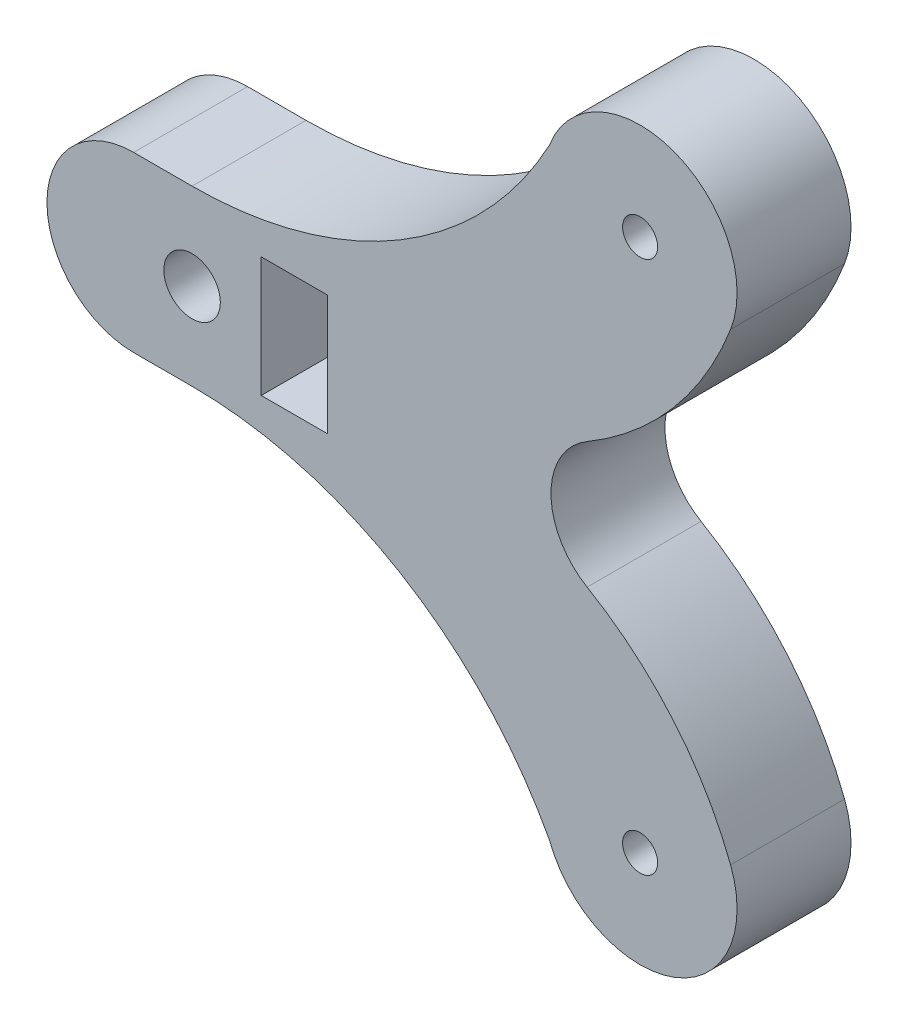
ISO-10303-21;
HEADER;
FILE_DESCRIPTION(('STEP AP214'),'2;1');
FILE_NAME('part.step','',(''),(''),'','','');
FILE_SCHEMA(('AUTOMOTIVE_DESIGN { 1 0 10303 214 1 1 1 1 }'));
ENDSEC;
DATA;
#1=APPLICATION_CONTEXT('core data for automotive mechanical design processes');
#2=APPLICATION_PROTOCOL_DEFINITION('international standard','automotive_design',2000,#1);
#3=PRODUCT_CONTEXT('',#1,'mechanical');
#4=PRODUCT('Part','Part','',(#3));
#5=PRODUCT_RELATED_PRODUCT_CATEGORY('part','',(#4));
#6=PRODUCT_DEFINITION_FORMATION('','',#4);
#7=PRODUCT_DEFINITION_CONTEXT('part definition',#1,'design');
#8=PRODUCT_DEFINITION('design','',#6,#7);
#9=PRODUCT_DEFINITION_SHAPE('','',#8);
#10=(LENGTH_UNIT() NAMED_UNIT(*) SI_UNIT(.MILLI.,.METRE.));
#11=(NAMED_UNIT(*) PLANE_ANGLE_UNIT() SI_UNIT($,.RADIAN.));
#12=(NAMED_UNIT(*) SI_UNIT($,.STERADIAN.) SOLID_ANGLE_UNIT());
#13=UNCERTAINTY_MEASURE_WITH_UNIT(LENGTH_MEASURE(1.E-05),#10,'distance_accuracy_value','');
#14=(GEOMETRIC_REPRESENTATION_CONTEXT(3) GLOBAL_UNCERTAINTY_ASSIGNED_CONTEXT((#13)) GLOBAL_UNIT_ASSIGNED_CONTEXT((#10,
#11,#12)) REPRESENTATION_CONTEXT('',''));
#15=CARTESIAN_POINT('',(0.,0.,0.));
#16=DIRECTION('',(0.,0.,1.));
#17=DIRECTION('',(1.,0.,0.));
#18=AXIS2_PLACEMENT_3D('',#15,#16,#17);
#19=CARTESIAN_POINT('',(588.919699582057,410.117464707351,5.85));
#20=DIRECTION('',(0.,0.,-1.));
#21=DIRECTION('',(-1.,0.,0.));
#22=AXIS2_PLACEMENT_3D('',#19,#20,#21);
#23=PLANE('',#22);
#24=CARTESIAN_POINT('',(588.919699582057,435.365819013464,5.85));
#25=DIRECTION('',(0.,0.,1.));
#26=DIRECTION('',(1.,0.,0.));
#27=AXIS2_PLACEMENT_3D('',#24,#25,#26);
#28=CIRCLE('',#27,1.44981300000002);
#29=CARTESIAN_POINT('',(590.369512582057,435.365819013464,5.85));
#30=VERTEX_POINT('',#29);
#31=EDGE_CURVE('E187',#30,#30,#28,.T.);
#32=ORIENTED_EDGE('',*,*,#31,.F.);
#33=EDGE_LOOP('',(#32));
#34=FACE_BOUND('',#33,.T.);
#35=CARTESIAN_POINT('',(611.919699582057,449.057086684598,5.85));
#36=DIRECTION('',(0.,0.,1.));
#37=DIRECTION('',(1.,0.,0.));
#38=AXIS2_PLACEMENT_3D('',#35,#36,#37);
#39=CIRCLE('',#38,0.899963000000106);
#40=CARTESIAN_POINT('',(612.819662582057,449.057086684598,5.85));
#41=VERTEX_POINT('',#40);
#42=EDGE_CURVE('E188',#41,#41,#39,.T.);
#43=ORIENTED_EDGE('',*,*,#42,.F.);
#44=EDGE_LOOP('',(#43));
#45=FACE_BOUND('',#44,.T.);
#46=CARTESIAN_POINT('',(588.919699582057,410.117464707351,5.85));
#47=DIRECTION('',(0.,0.,-1.));
#48=DIRECTION('',(-1.,0.,0.));
#49=AXIS2_PLACEMENT_3D('',#46,#47,#48);
#50=CIRCLE('',#49,20.7985413061131);
#51=CARTESIAN_POINT('',(588.919699582057,430.916006013464,5.85));
#52=VERTEX_POINT('',#51);
#53=CARTESIAN_POINT('',(607.258051131711,419.929915109946,5.85));
#54=VERTEX_POINT('',#53);
#55=EDGE_CURVE('E201',#52,#54,#50,.T.);
#56=ORIENTED_EDGE('',*,*,#55,.T.);
#57=CARTESIAN_POINT('',(611.919699582057,421.674551342329,5.85));
#58=DIRECTION('',(0.,0.,1.));
#59=DIRECTION('',(1.,0.,0.));
#60=AXIS2_PLACEMENT_3D('',#57,#58,#59);
#61=CIRCLE('',#60,4.9774212056002);
#62=CARTESIAN_POINT('',(616.564448765373,423.463692723563,5.85));
#63=VERTEX_POINT('',#62);
#64=EDGE_CURVE('E205',#54,#63,#61,.T.);
#65=ORIENTED_EDGE('',*,*,#64,.T.);
#66=CARTESIAN_POINT('',(600.508172124817,417.278870285931,5.85));
#67=DIRECTION('',(0.,0.,1.));
#68=DIRECTION('',(-1.,0.,0.));
#69=AXIS2_PLACEMENT_3D('',#66,#67,#68);
#70=CIRCLE('',#69,17.2062793230583);
#71=CARTESIAN_POINT('',(609.19986076651,432.128469495976,5.85));
#72=VERTEX_POINT('',#71);
#73=EDGE_CURVE('E210',#63,#72,#70,.T.);
#74=ORIENTED_EDGE('',*,*,#73,.T.);
#75=CARTESIAN_POINT('',(611.09472901395,435.365819013464,5.85));
#76=DIRECTION('',(0.,0.,-1.));
#77=DIRECTION('',(1.,0.,0.));
#78=AXIS2_PLACEMENT_3D('',#75,#76,#77);
#79=CIRCLE('',#78,3.75112750696853);
#80=CARTESIAN_POINT('',(609.199860766509,438.603168530952,5.85));
#81=VERTEX_POINT('',#80);
#82=EDGE_CURVE('E214',#72,#81,#79,.T.);
#83=ORIENTED_EDGE('',*,*,#82,.T.);
#84=CARTESIAN_POINT('',(600.508172124817,453.452767740997,5.85));
#85=DIRECTION('',(0.,0.,1.));
#86=DIRECTION('',(1.,0.,0.));
#87=AXIS2_PLACEMENT_3D('',#84,#85,#86);
#88=CIRCLE('',#87,17.2062793230582);
#89=CARTESIAN_POINT('',(616.564448765373,447.267945303365,5.85));
#90=VERTEX_POINT('',#89);
#91=EDGE_CURVE('E222',#81,#90,#88,.T.);
#92=ORIENTED_EDGE('',*,*,#91,.T.);
#93=CARTESIAN_POINT('',(611.919699582057,449.057086684598,5.85));
#94=DIRECTION('',(0.,0.,1.));
#95=DIRECTION('',(-1.,0.,0.));
#96=AXIS2_PLACEMENT_3D('',#93,#94,#95);
#97=CIRCLE('',#96,4.97742120560018);
#98=CARTESIAN_POINT('',(607.258051131711,450.801722916982,5.85));
#99=VERTEX_POINT('',#98);
#100=EDGE_CURVE('E225',#90,#99,#97,.T.);
#101=ORIENTED_EDGE('',*,*,#100,.T.);
#102=CARTESIAN_POINT('',(588.919699582057,460.614173319577,5.85));
#103=DIRECTION('',(0.,0.,-1.));
#104=DIRECTION('',(1.,0.,0.));
#105=AXIS2_PLACEMENT_3D('',#102,#103,#104);
#106=CIRCLE('',#105,20.7985413061131);
#107=CARTESIAN_POINT('',(588.919699582057,439.815632013464,5.85));
#108=VERTEX_POINT('',#107);
#109=EDGE_CURVE('E229',#99,#108,#106,.T.);
#110=ORIENTED_EDGE('',*,*,#109,.T.);
#111=DIRECTION('',(-1.,0.,0.));
#112=VECTOR('',#111,1.);
#113=CARTESIAN_POINT('',(588.919699582057,439.815632013464,5.85));
#114=LINE('',#113,#112);
#115=CARTESIAN_POINT('',(585.919699582057,439.815632013464,5.85));
#116=VERTEX_POINT('',#115);
#117=EDGE_CURVE('E233',#108,#116,#114,.T.);
#118=ORIENTED_EDGE('',*,*,#117,.T.);
#119=CARTESIAN_POINT('',(585.919699582057,435.365819013464,5.85));
#120=DIRECTION('',(0.,0.,1.));
#121=DIRECTION('',(1.,0.,0.));
#122=AXIS2_PLACEMENT_3D('',#119,#120,#121);
#123=CIRCLE('',#122,4.44981300000002);
#124=CARTESIAN_POINT('',(585.919699582057,430.916006013464,5.85));
#125=VERTEX_POINT('',#124);
#126=EDGE_CURVE('E237',#116,#125,#123,.T.);
#127=ORIENTED_EDGE('',*,*,#126,.T.);
#128=DIRECTION('',(1.,0.,0.));
#129=VECTOR('',#128,1.);
#130=CARTESIAN_POINT('',(588.919699582057,430.916006013464,5.85));
#131=LINE('',#130,#129);
#132=EDGE_CURVE('E240',#125,#52,#131,.T.);
#133=ORIENTED_EDGE('',*,*,#132,.T.);
#134=EDGE_LOOP('',(#56,#65,#74,#83,#92,#101,#110,#118,#127,#133));
#135=FACE_BOUND('',#134,.T.);
#136=CARTESIAN_POINT('',(611.919699582057,421.674551342329,5.85));
#137=DIRECTION('',(0.,0.,1.));
#138=DIRECTION('',(1.,0.,0.));
#139=AXIS2_PLACEMENT_3D('',#136,#137,#138);
#140=CIRCLE('',#139,0.899963000000106);
#141=CARTESIAN_POINT('',(612.819662582057,421.674551342329,5.85));
#142=VERTEX_POINT('',#141);
#143=EDGE_CURVE('E176',#142,#142,#140,.T.);
#144=ORIENTED_EDGE('',*,*,#143,.F.);
#145=EDGE_LOOP('',(#144));
#146=FACE_BOUND('',#145,.T.);
#147=DIRECTION('',(0.,-1.,0.));
#148=VECTOR('',#147,1.);
#149=CARTESIAN_POINT('',(592.469512582057,432.283227624903,5.85));
#150=LINE('',#149,#148);
#151=CARTESIAN_POINT('',(592.469512582057,438.448410402024,5.85));
#152=VERTEX_POINT('',#151);
#153=CARTESIAN_POINT('',(592.469512582057,432.283227624903,5.85));
#154=VERTEX_POINT('',#153);
#155=EDGE_CURVE('E137',#152,#154,#150,.T.);
#156=ORIENTED_EDGE('',*,*,#155,.F.);
#157=DIRECTION('',(-1.,0.,0.));
#158=VECTOR('',#157,1.);
#159=CARTESIAN_POINT('',(592.469512582057,438.448410402024,5.85));
#160=LINE('',#159,#158);
#161=CARTESIAN_POINT('',(595.869523582057,438.448410402024,5.85));
#162=VERTEX_POINT('',#161);
#163=EDGE_CURVE('E161',#162,#152,#160,.T.);
#164=ORIENTED_EDGE('',*,*,#163,.F.);
#165=DIRECTION('',(0.,1.,0.));
#166=VECTOR('',#165,1.);
#167=CARTESIAN_POINT('',(595.869523582057,438.448410402024,5.85));
#168=LINE('',#167,#166);
#169=CARTESIAN_POINT('',(595.869523582057,432.283227624903,5.85));
#170=VERTEX_POINT('',#169);
#171=EDGE_CURVE('E158',#170,#162,#168,.T.);
#172=ORIENTED_EDGE('',*,*,#171,.F.);
#173=DIRECTION('',(1.,0.,0.));
#174=VECTOR('',#173,1.);
#175=CARTESIAN_POINT('',(595.869523582057,432.283227624903,5.85));
#176=LINE('',#175,#174);
#177=EDGE_CURVE('E146',#154,#170,#176,.T.);
#178=ORIENTED_EDGE('',*,*,#177,.F.);
#179=EDGE_LOOP('',(#156,#164,#172,#178));
#180=FACE_BOUND('',#179,.T.);
#181=ADVANCED_FACE('F36',(#34,#45,#135,#146,#180),#23,.F.);
#182=CARTESIAN_POINT('',(588.919699582057,410.117464707351,0.));
#183=DIRECTION('',(0.,0.,-1.));
#184=DIRECTION('',(-1.,0.,0.));
#185=AXIS2_PLACEMENT_3D('',#182,#183,#184);
#186=PLANE('',#185);
#187=CARTESIAN_POINT('',(588.919699582057,435.365819013464,0.));
#188=DIRECTION('',(0.,0.,1.));
#189=DIRECTION('',(1.,0.,0.));
#190=AXIS2_PLACEMENT_3D('',#187,#188,#189);
#191=CIRCLE('',#190,1.44981300000002);
#192=CARTESIAN_POINT('',(590.369512582057,435.365819013464,0.));
#193=VERTEX_POINT('',#192);
#194=EDGE_CURVE('E154',#193,#193,#191,.T.);
#195=ORIENTED_EDGE('',*,*,#194,.T.);
#196=EDGE_LOOP('',(#195));
#197=FACE_BOUND('',#196,.T.);
#198=CARTESIAN_POINT('',(611.919699582057,449.057086684598,0.));
#199=DIRECTION('',(0.,0.,1.));
#200=DIRECTION('',(1.,0.,0.));
#201=AXIS2_PLACEMENT_3D('',#198,#199,#200);
#202=CIRCLE('',#201,0.899963000000106);
#203=CARTESIAN_POINT('',(612.819662582057,449.057086684598,0.));
#204=VERTEX_POINT('',#203);
#205=EDGE_CURVE('E182',#204,#204,#202,.T.);
#206=ORIENTED_EDGE('',*,*,#205,.T.);
#207=EDGE_LOOP('',(#206));
#208=FACE_BOUND('',#207,.T.);
#209=CARTESIAN_POINT('',(588.919699582057,410.117464707351,0.));
#210=DIRECTION('',(0.,0.,-1.));
#211=DIRECTION('',(-1.,0.,0.));
#212=AXIS2_PLACEMENT_3D('',#209,#210,#211);
#213=CIRCLE('',#212,20.7985413061131);
#214=CARTESIAN_POINT('',(588.919699582057,430.916006013464,0.));
#215=VERTEX_POINT('',#214);
#216=CARTESIAN_POINT('',(607.258051131711,419.929915109946,0.));
#217=VERTEX_POINT('',#216);
#218=EDGE_CURVE('E193',#215,#217,#213,.T.);
#219=ORIENTED_EDGE('',*,*,#218,.F.);
#220=DIRECTION('',(1.,0.,0.));
#221=VECTOR('',#220,1.);
#222=CARTESIAN_POINT('',(588.919699582057,430.916006013464,0.));
#223=LINE('',#222,#221);
#224=CARTESIAN_POINT('',(585.919699582057,430.916006013464,0.));
#225=VERTEX_POINT('',#224);
#226=EDGE_CURVE('E206',#225,#215,#223,.T.);
#227=ORIENTED_EDGE('',*,*,#226,.F.);
#228=CARTESIAN_POINT('',(585.919699582057,435.365819013464,0.));
#229=DIRECTION('',(0.,0.,1.));
#230=DIRECTION('',(1.,0.,0.));
#231=AXIS2_PLACEMENT_3D('',#228,#229,#230);
#232=CIRCLE('',#231,4.44981300000002);
#233=CARTESIAN_POINT('',(585.919699582057,439.815632013464,0.));
#234=VERTEX_POINT('',#233);
#235=EDGE_CURVE('E261',#234,#225,#232,.T.);
#236=ORIENTED_EDGE('',*,*,#235,.F.);
#237=DIRECTION('',(-1.,0.,0.));
#238=VECTOR('',#237,1.);
#239=CARTESIAN_POINT('',(588.919699582057,439.815632013464,0.));
#240=LINE('',#239,#238);
#241=CARTESIAN_POINT('',(588.919699582057,439.815632013464,0.));
#242=VERTEX_POINT('',#241);
#243=EDGE_CURVE('E259',#242,#234,#240,.T.);
#244=ORIENTED_EDGE('',*,*,#243,.F.);
#245=CARTESIAN_POINT('',(588.919699582057,460.614173319577,0.));
#246=DIRECTION('',(0.,0.,-1.));
#247=DIRECTION('',(1.,0.,0.));
#248=AXIS2_PLACEMENT_3D('',#245,#246,#247);
#249=CIRCLE('',#248,20.7985413061131);
#250=CARTESIAN_POINT('',(607.258051131711,450.801722916982,0.));
#251=VERTEX_POINT('',#250);
#252=EDGE_CURVE('E257',#251,#242,#249,.T.);
#253=ORIENTED_EDGE('',*,*,#252,.F.);
#254=CARTESIAN_POINT('',(611.919699582057,449.057086684598,0.));
#255=DIRECTION('',(0.,0.,1.));
#256=DIRECTION('',(-1.,0.,0.));
#257=AXIS2_PLACEMENT_3D('',#254,#255,#256);
#258=CIRCLE('',#257,4.97742120560018);
#259=CARTESIAN_POINT('',(616.564448765373,447.267945303365,0.));
#260=VERTEX_POINT('',#259);
#261=EDGE_CURVE('E255',#260,#251,#258,.T.);
#262=ORIENTED_EDGE('',*,*,#261,.F.);
#263=CARTESIAN_POINT('',(600.508172124817,453.452767740997,0.));
#264=DIRECTION('',(0.,0.,1.));
#265=DIRECTION('',(1.,0.,0.));
#266=AXIS2_PLACEMENT_3D('',#263,#264,#265);
#267=CIRCLE('',#266,17.2062793230582);
#268=CARTESIAN_POINT('',(609.199860766509,438.603168530952,0.));
#269=VERTEX_POINT('',#268);
#270=EDGE_CURVE('E253',#269,#260,#267,.T.);
#271=ORIENTED_EDGE('',*,*,#270,.F.);
#272=CARTESIAN_POINT('',(611.09472901395,435.365819013464,0.));
#273=DIRECTION('',(0.,0.,-1.));
#274=DIRECTION('',(1.,0.,0.));
#275=AXIS2_PLACEMENT_3D('',#272,#273,#274);
#276=CIRCLE('',#275,3.75112750696853);
#277=CARTESIAN_POINT('',(609.19986076651,432.128469495976,0.));
#278=VERTEX_POINT('',#277);
#279=EDGE_CURVE('E251',#278,#269,#276,.T.);
#280=ORIENTED_EDGE('',*,*,#279,.F.);
#281=CARTESIAN_POINT('',(600.508172124817,417.278870285931,0.));
#282=DIRECTION('',(0.,0.,1.));
#283=DIRECTION('',(-1.,0.,0.));
#284=AXIS2_PLACEMENT_3D('',#281,#282,#283);
#285=CIRCLE('',#284,17.2062793230583);
#286=CARTESIAN_POINT('',(616.564448765373,423.463692723563,0.));
#287=VERTEX_POINT('',#286);
#288=EDGE_CURVE('E249',#287,#278,#285,.T.);
#289=ORIENTED_EDGE('',*,*,#288,.F.);
#290=CARTESIAN_POINT('',(611.919699582057,421.674551342329,0.));
#291=DIRECTION('',(0.,0.,1.));
#292=DIRECTION('',(1.,0.,0.));
#293=AXIS2_PLACEMENT_3D('',#290,#291,#292);
#294=CIRCLE('',#293,4.9774212056002);
#295=EDGE_CURVE('E247',#217,#287,#294,.T.);
#296=ORIENTED_EDGE('',*,*,#295,.F.);
#297=EDGE_LOOP('',(#219,#227,#236,#244,#253,#262,#271,#280,#289,#296));
#298=FACE_BOUND('',#297,.T.);
#299=CARTESIAN_POINT('',(611.919699582057,421.674551342329,0.));
#300=DIRECTION('',(0.,0.,1.));
#301=DIRECTION('',(1.,0.,0.));
#302=AXIS2_PLACEMENT_3D('',#299,#300,#301);
#303=CIRCLE('',#302,0.899963000000106);
#304=CARTESIAN_POINT('',(612.819662582057,421.674551342329,0.));
#305=VERTEX_POINT('',#304);
#306=EDGE_CURVE('E183',#305,#305,#303,.T.);
#307=ORIENTED_EDGE('',*,*,#306,.T.);
#308=EDGE_LOOP('',(#307));
#309=FACE_BOUND('',#308,.T.);
#310=DIRECTION('',(-1.,0.,0.));
#311=VECTOR('',#310,1.);
#312=CARTESIAN_POINT('',(592.469512582057,438.448410402024,0.));
#313=LINE('',#312,#311);
#314=CARTESIAN_POINT('',(595.869523582057,438.448410402024,0.));
#315=VERTEX_POINT('',#314);
#316=CARTESIAN_POINT('',(592.469512582057,438.448410402024,0.));
#317=VERTEX_POINT('',#316);
#318=EDGE_CURVE('E147',#315,#317,#313,.T.);
#319=ORIENTED_EDGE('',*,*,#318,.T.);
#320=DIRECTION('',(0.,-1.,0.));
#321=VECTOR('',#320,1.);
#322=CARTESIAN_POINT('',(592.469512582057,432.283227624903,0.));
#323=LINE('',#322,#321);
#324=CARTESIAN_POINT('',(592.469512582057,432.283227624903,0.));
#325=VERTEX_POINT('',#324);
#326=EDGE_CURVE('E59',#317,#325,#323,.T.);
#327=ORIENTED_EDGE('',*,*,#326,.T.);
#328=DIRECTION('',(1.,0.,0.));
#329=VECTOR('',#328,1.);
#330=CARTESIAN_POINT('',(595.869523582057,432.283227624903,0.));
#331=LINE('',#330,#329);
#332=CARTESIAN_POINT('',(595.869523582057,432.283227624903,0.));
#333=VERTEX_POINT('',#332);
#334=EDGE_CURVE('E153',#325,#333,#331,.T.);
#335=ORIENTED_EDGE('',*,*,#334,.T.);
#336=DIRECTION('',(0.,1.,0.));
#337=VECTOR('',#336,1.);
#338=CARTESIAN_POINT('',(595.869523582057,438.448410402024,0.));
#339=LINE('',#338,#337);
#340=EDGE_CURVE('E512',#333,#315,#339,.T.);
#341=ORIENTED_EDGE('',*,*,#340,.T.);
#342=EDGE_LOOP('',(#319,#327,#335,#341));
#343=FACE_BOUND('',#342,.T.);
#344=ADVANCED_FACE('F297',(#197,#208,#298,#309,#343),#186,.T.);
#345=CARTESIAN_POINT('',(588.919699582057,410.117464707351,5.85));
#346=DIRECTION('',(0.,0.,-1.));
#347=DIRECTION('',(-1.,0.,0.));
#348=AXIS2_PLACEMENT_3D('',#345,#346,#347);
#349=CYLINDRICAL_SURFACE('',#348,20.7985413061131);
#350=ORIENTED_EDGE('',*,*,#218,.T.);
#351=DIRECTION('',(0.,0.,-1.));
#352=VECTOR('',#351,1.);
#353=CARTESIAN_POINT('',(607.258051131711,419.929915109946,5.85));
#354=LINE('',#353,#352);
#355=EDGE_CURVE('E12',#54,#217,#354,.T.);
#356=ORIENTED_EDGE('',*,*,#355,.F.);
#357=ORIENTED_EDGE('',*,*,#55,.F.);
#358=DIRECTION('',(0.,0.,-1.));
#359=VECTOR('',#358,1.);
#360=CARTESIAN_POINT('',(588.919699582057,430.916006013464,5.85));
#361=LINE('',#360,#359);
#362=EDGE_CURVE('E244',#52,#215,#361,.T.);
#363=ORIENTED_EDGE('',*,*,#362,.T.);
#364=EDGE_LOOP('',(#350,#356,#357,#363));
#365=FACE_BOUND('',#364,.T.);
#366=ADVANCED_FACE('F38',(#365),#349,.F.);
#367=CARTESIAN_POINT('',(611.919699582057,421.674551342329,5.85));
#368=DIRECTION('',(0.,0.,-1.));
#369=DIRECTION('',(-1.,0.,0.));
#370=AXIS2_PLACEMENT_3D('',#367,#368,#369);
#371=CYLINDRICAL_SURFACE('',#370,4.9774212056002);
#372=ORIENTED_EDGE('',*,*,#295,.T.);
#373=DIRECTION('',(0.,0.,-1.));
#374=VECTOR('',#373,1.);
#375=CARTESIAN_POINT('',(616.564448765373,423.463692723563,5.85));
#376=LINE('',#375,#374);
#377=EDGE_CURVE('E44',#63,#287,#376,.T.);
#378=ORIENTED_EDGE('',*,*,#377,.F.);
#379=ORIENTED_EDGE('',*,*,#64,.F.);
#380=ORIENTED_EDGE('',*,*,#355,.T.);
#381=EDGE_LOOP('',(#372,#378,#379,#380));
#382=FACE_BOUND('',#381,.T.);
#383=ADVANCED_FACE('F379',(#382),#371,.T.);
#384=CARTESIAN_POINT('',(600.508172124817,417.278870285931,5.85));
#385=DIRECTION('',(0.,0.,-1.));
#386=DIRECTION('',(-1.,0.,0.));
#387=AXIS2_PLACEMENT_3D('',#384,#385,#386);
#388=CYLINDRICAL_SURFACE('',#387,17.2062793230583);
#389=ORIENTED_EDGE('',*,*,#288,.T.);
#390=DIRECTION('',(0.,0.,-1.));
#391=VECTOR('',#390,1.);
#392=CARTESIAN_POINT('',(609.19986076651,432.128469495976,5.85));
#393=LINE('',#392,#391);
#394=EDGE_CURVE('E284',#72,#278,#393,.T.);
#395=ORIENTED_EDGE('',*,*,#394,.F.);
#396=ORIENTED_EDGE('',*,*,#73,.F.);
#397=ORIENTED_EDGE('',*,*,#377,.T.);
#398=EDGE_LOOP('',(#389,#395,#396,#397));
#399=FACE_BOUND('',#398,.T.);
#400=ADVANCED_FACE('F291',(#399),#388,.T.);
#401=CARTESIAN_POINT('',(611.09472901395,435.365819013464,5.85));
#402=DIRECTION('',(0.,0.,-1.));
#403=DIRECTION('',(-1.,0.,0.));
#404=AXIS2_PLACEMENT_3D('',#401,#402,#403);
#405=CYLINDRICAL_SURFACE('',#404,3.75112750696853);
#406=ORIENTED_EDGE('',*,*,#279,.T.);
#407=DIRECTION('',(0.,0.,-1.));
#408=VECTOR('',#407,1.);
#409=CARTESIAN_POINT('',(609.199860766509,438.603168530952,5.85));
#410=LINE('',#409,#408);
#411=EDGE_CURVE('E281',#81,#269,#410,.T.);
#412=ORIENTED_EDGE('',*,*,#411,.F.);
#413=ORIENTED_EDGE('',*,*,#82,.F.);
#414=ORIENTED_EDGE('',*,*,#394,.T.);
#415=EDGE_LOOP('',(#406,#412,#413,#414));
#416=FACE_BOUND('',#415,.T.);
#417=ADVANCED_FACE('F303',(#416),#405,.F.);
#418=CARTESIAN_POINT('',(600.508172124817,453.452767740997,5.85));
#419=DIRECTION('',(0.,0.,-1.));
#420=DIRECTION('',(-1.,0.,0.));
#421=AXIS2_PLACEMENT_3D('',#418,#419,#420);
#422=CYLINDRICAL_SURFACE('',#421,17.2062793230582);
#423=ORIENTED_EDGE('',*,*,#270,.T.);
#424=DIRECTION('',(0.,0.,-1.));
#425=VECTOR('',#424,1.);
#426=CARTESIAN_POINT('',(616.564448765373,447.267945303365,5.85));
#427=LINE('',#426,#425);
#428=EDGE_CURVE('E278',#90,#260,#427,.T.);
#429=ORIENTED_EDGE('',*,*,#428,.F.);
#430=ORIENTED_EDGE('',*,*,#91,.F.);
#431=ORIENTED_EDGE('',*,*,#411,.T.);
#432=EDGE_LOOP('',(#423,#429,#430,#431));
#433=FACE_BOUND('',#432,.T.);
#434=ADVANCED_FACE('F307',(#433),#422,.T.);
#435=CARTESIAN_POINT('',(611.919699582057,449.057086684598,5.85));
#436=DIRECTION('',(0.,0.,-1.));
#437=DIRECTION('',(-1.,0.,0.));
#438=AXIS2_PLACEMENT_3D('',#435,#436,#437);
#439=CYLINDRICAL_SURFACE('',#438,4.97742120560018);
#440=ORIENTED_EDGE('',*,*,#261,.T.);
#441=DIRECTION('',(0.,0.,-1.));
#442=VECTOR('',#441,1.);
#443=CARTESIAN_POINT('',(607.258051131711,450.801722916982,5.85));
#444=LINE('',#443,#442);
#445=EDGE_CURVE('E275',#99,#251,#444,.T.);
#446=ORIENTED_EDGE('',*,*,#445,.F.);
#447=ORIENTED_EDGE('',*,*,#100,.F.);
#448=ORIENTED_EDGE('',*,*,#428,.T.);
#449=EDGE_LOOP('',(#440,#446,#447,#448));
#450=FACE_BOUND('',#449,.T.);
#451=ADVANCED_FACE('F369',(#450),#439,.T.);
#452=CARTESIAN_POINT('',(588.919699582057,460.614173319577,5.85));
#453=DIRECTION('',(0.,0.,-1.));
#454=DIRECTION('',(-1.,0.,0.));
#455=AXIS2_PLACEMENT_3D('',#452,#453,#454);
#456=CYLINDRICAL_SURFACE('',#455,20.7985413061131);
#457=ORIENTED_EDGE('',*,*,#252,.T.);
#458=DIRECTION('',(0.,0.,-1.));
#459=VECTOR('',#458,1.);
#460=CARTESIAN_POINT('',(588.919699582057,439.815632013464,5.85));
#461=LINE('',#460,#459);
#462=EDGE_CURVE('E272',#108,#242,#461,.T.);
#463=ORIENTED_EDGE('',*,*,#462,.F.);
#464=ORIENTED_EDGE('',*,*,#109,.F.);
#465=ORIENTED_EDGE('',*,*,#445,.T.);
#466=EDGE_LOOP('',(#457,#463,#464,#465));
#467=FACE_BOUND('',#466,.T.);
#468=ADVANCED_FACE('F365',(#467),#456,.F.);
#469=CARTESIAN_POINT('',(588.919699582057,439.815632013464,5.85));
#470=DIRECTION('',(0.,-1.,0.));
#471=DIRECTION('',(0.,0.,-1.));
#472=AXIS2_PLACEMENT_3D('',#469,#470,#471);
#473=PLANE('',#472);
#474=ORIENTED_EDGE('',*,*,#243,.T.);
#475=DIRECTION('',(0.,0.,-1.));
#476=VECTOR('',#475,1.);
#477=CARTESIAN_POINT('',(585.919699582057,439.815632013464,5.85));
#478=LINE('',#477,#476);
#479=EDGE_CURVE('E269',#116,#234,#478,.T.);
#480=ORIENTED_EDGE('',*,*,#479,.F.);
#481=ORIENTED_EDGE('',*,*,#117,.F.);
#482=ORIENTED_EDGE('',*,*,#462,.T.);
#483=EDGE_LOOP('',(#474,#480,#481,#482));
#484=FACE_BOUND('',#483,.T.);
#485=ADVANCED_FACE('F361',(#484),#473,.F.);
#486=CARTESIAN_POINT('',(585.919699582057,435.365819013464,5.85));
#487=DIRECTION('',(0.,0.,-1.));
#488=DIRECTION('',(-1.,0.,0.));
#489=AXIS2_PLACEMENT_3D('',#486,#487,#488);
#490=CYLINDRICAL_SURFACE('',#489,4.44981300000002);
#491=ORIENTED_EDGE('',*,*,#235,.T.);
#492=DIRECTION('',(0.,0.,-1.));
#493=VECTOR('',#492,1.);
#494=CARTESIAN_POINT('',(585.919699582057,430.916006013464,5.85));
#495=LINE('',#494,#493);
#496=EDGE_CURVE('E266',#125,#225,#495,.T.);
#497=ORIENTED_EDGE('',*,*,#496,.F.);
#498=ORIENTED_EDGE('',*,*,#126,.F.);
#499=ORIENTED_EDGE('',*,*,#479,.T.);
#500=EDGE_LOOP('',(#491,#497,#498,#499));
#501=FACE_BOUND('',#500,.T.);
#502=ADVANCED_FACE('F357',(#501),#490,.T.);
#503=CARTESIAN_POINT('',(588.919699582057,430.916006013464,5.85));
#504=DIRECTION('',(0.,1.,0.));
#505=DIRECTION('',(0.,0.,1.));
#506=AXIS2_PLACEMENT_3D('',#503,#504,#505);
#507=PLANE('',#506);
#508=ORIENTED_EDGE('',*,*,#226,.T.);
#509=ORIENTED_EDGE('',*,*,#362,.F.);
#510=ORIENTED_EDGE('',*,*,#132,.F.);
#511=ORIENTED_EDGE('',*,*,#496,.T.);
#512=EDGE_LOOP('',(#508,#509,#510,#511));
#513=FACE_BOUND('',#512,.T.);
#514=ADVANCED_FACE('F354',(#513),#507,.F.);
#515=CARTESIAN_POINT('',(611.919699582057,449.057086684598,5.85));
#516=DIRECTION('',(0.,0.,-1.));
#517=DIRECTION('',(-1.,0.,0.));
#518=AXIS2_PLACEMENT_3D('',#515,#516,#517);
#519=CYLINDRICAL_SURFACE('',#518,0.899963000000106);
#520=ORIENTED_EDGE('',*,*,#42,.T.);
#521=EDGE_LOOP('',(#520));
#522=FACE_BOUND('',#521,.T.);
#523=ORIENTED_EDGE('',*,*,#205,.F.);
#524=EDGE_LOOP('',(#523));
#525=FACE_BOUND('',#524,.T.);
#526=ADVANCED_FACE('F341',(#522,#525),#519,.F.);
#527=CARTESIAN_POINT('',(611.919699582057,421.674551342329,5.85));
#528=DIRECTION('',(0.,0.,-1.));
#529=DIRECTION('',(-1.,0.,0.));
#530=AXIS2_PLACEMENT_3D('',#527,#528,#529);
#531=CYLINDRICAL_SURFACE('',#530,0.899963000000106);
#532=ORIENTED_EDGE('',*,*,#143,.T.);
#533=EDGE_LOOP('',(#532));
#534=FACE_BOUND('',#533,.T.);
#535=ORIENTED_EDGE('',*,*,#306,.F.);
#536=EDGE_LOOP('',(#535));
#537=FACE_BOUND('',#536,.T.);
#538=ADVANCED_FACE('F334',(#534,#537),#531,.F.);
#539=CARTESIAN_POINT('',(588.919699582057,435.365819013464,5.85));
#540=DIRECTION('',(0.,0.,-1.));
#541=DIRECTION('',(-1.,0.,0.));
#542=AXIS2_PLACEMENT_3D('',#539,#540,#541);
#543=CYLINDRICAL_SURFACE('',#542,1.44981300000002);
#544=ORIENTED_EDGE('',*,*,#31,.T.);
#545=EDGE_LOOP('',(#544));
#546=FACE_BOUND('',#545,.T.);
#547=ORIENTED_EDGE('',*,*,#194,.F.);
#548=EDGE_LOOP('',(#547));
#549=FACE_BOUND('',#548,.T.);
#550=ADVANCED_FACE('F332',(#546,#549),#543,.F.);
#551=CARTESIAN_POINT('',(592.469512582057,432.283227624903,5.85));
#552=DIRECTION('',(1.,0.,0.));
#553=DIRECTION('',(0.,0.,-1.));
#554=AXIS2_PLACEMENT_3D('',#551,#552,#553);
#555=PLANE('',#554);
#556=ORIENTED_EDGE('',*,*,#326,.F.);
#557=DIRECTION('',(0.,0.,-1.));
#558=VECTOR('',#557,1.);
#559=CARTESIAN_POINT('',(592.469512582057,438.448410402024,5.85));
#560=LINE('',#559,#558);
#561=EDGE_CURVE('E141',#152,#317,#560,.T.);
#562=ORIENTED_EDGE('',*,*,#561,.F.);
#563=ORIENTED_EDGE('',*,*,#155,.T.);
#564=DIRECTION('',(0.,0.,-1.));
#565=VECTOR('',#564,1.);
#566=CARTESIAN_POINT('',(592.469512582057,432.283227624903,5.85));
#567=LINE('',#566,#565);
#568=EDGE_CURVE('E140',#154,#325,#567,.T.);
#569=ORIENTED_EDGE('',*,*,#568,.T.);
#570=EDGE_LOOP('',(#556,#562,#563,#569));
#571=FACE_BOUND('',#570,.T.);
#572=ADVANCED_FACE('F139',(#571),#555,.T.);
#573=CARTESIAN_POINT('',(595.869523582057,432.283227624903,5.85));
#574=DIRECTION('',(0.,1.,0.));
#575=DIRECTION('',(0.,0.,1.));
#576=AXIS2_PLACEMENT_3D('',#573,#574,#575);
#577=PLANE('',#576);
#578=ORIENTED_EDGE('',*,*,#334,.F.);
#579=ORIENTED_EDGE('',*,*,#568,.F.);
#580=ORIENTED_EDGE('',*,*,#177,.T.);
#581=DIRECTION('',(0.,0.,-1.));
#582=VECTOR('',#581,1.);
#583=CARTESIAN_POINT('',(595.869523582057,432.283227624903,5.85));
#584=LINE('',#583,#582);
#585=EDGE_CURVE('E155',#170,#333,#584,.T.);
#586=ORIENTED_EDGE('',*,*,#585,.T.);
#587=EDGE_LOOP('',(#578,#579,#580,#586));
#588=FACE_BOUND('',#587,.T.);
#589=ADVANCED_FACE('F150',(#588),#577,.T.);
#590=CARTESIAN_POINT('',(595.869523582057,438.448410402024,5.85));
#591=DIRECTION('',(-1.,0.,0.));
#592=DIRECTION('',(0.,0.,1.));
#593=AXIS2_PLACEMENT_3D('',#590,#591,#592);
#594=PLANE('',#593);
#595=ORIENTED_EDGE('',*,*,#340,.F.);
#596=ORIENTED_EDGE('',*,*,#585,.F.);
#597=ORIENTED_EDGE('',*,*,#171,.T.);
#598=DIRECTION('',(0.,0.,-1.));
#599=VECTOR('',#598,1.);
#600=CARTESIAN_POINT('',(595.869523582057,438.448410402024,5.85));
#601=LINE('',#600,#599);
#602=EDGE_CURVE('E51',#162,#315,#601,.T.);
#603=ORIENTED_EDGE('',*,*,#602,.T.);
#604=EDGE_LOOP('',(#595,#596,#597,#603));
#605=FACE_BOUND('',#604,.T.);
#606=ADVANCED_FACE('F488',(#605),#594,.T.);
#607=CARTESIAN_POINT('',(592.469512582057,438.448410402024,5.85));
#608=DIRECTION('',(0.,-1.,0.));
#609=DIRECTION('',(0.,0.,-1.));
#610=AXIS2_PLACEMENT_3D('',#607,#608,#609);
#611=PLANE('',#610);
#612=ORIENTED_EDGE('',*,*,#318,.F.);
#613=ORIENTED_EDGE('',*,*,#602,.F.);
#614=ORIENTED_EDGE('',*,*,#163,.T.);
#615=ORIENTED_EDGE('',*,*,#561,.T.);
#616=EDGE_LOOP('',(#612,#613,#614,#615));
#617=FACE_BOUND('',#616,.T.);
#618=ADVANCED_FACE('F496',(#617),#611,.T.);
#619=CLOSED_SHELL('',(#181,#344,#366,#383,#400,#417,#434,#451,#468,#485,#502,#514,#526,#538,
#550,#572,#589,#606,#618));
#620=MANIFOLD_SOLID_BREP('B2',#619);
#621=ADVANCED_BREP_SHAPE_REPRESENTATION('',(#18,#620),#14);
#622=SHAPE_DEFINITION_REPRESENTATION(#9,#621);
ENDSEC;
END-ISO-10303-21;
